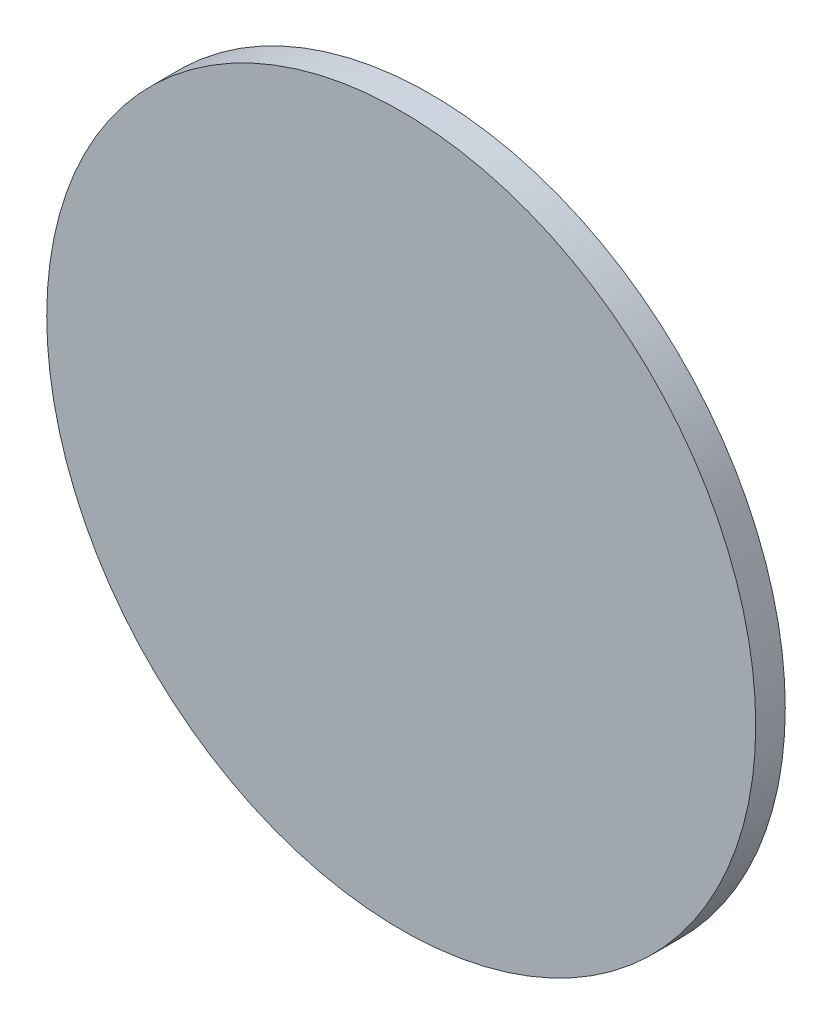
ISO-10303-21;
HEADER;
FILE_DESCRIPTION(('STEP AP214'),'2;1');
FILE_NAME('part.step','',(''),(''),'','','');
FILE_SCHEMA(('AUTOMOTIVE_DESIGN { 1 0 10303 214 1 1 1 1 }'));
ENDSEC;
DATA;
#1=APPLICATION_CONTEXT('core data for automotive mechanical design processes');
#2=APPLICATION_PROTOCOL_DEFINITION('international standard','automotive_design',2000,#1);
#3=PRODUCT_CONTEXT('',#1,'mechanical');
#4=PRODUCT('Part','Part','',(#3));
#5=PRODUCT_RELATED_PRODUCT_CATEGORY('part','',(#4));
#6=PRODUCT_DEFINITION_FORMATION('','',#4);
#7=PRODUCT_DEFINITION_CONTEXT('part definition',#1,'design');
#8=PRODUCT_DEFINITION('design','',#6,#7);
#9=PRODUCT_DEFINITION_SHAPE('','',#8);
#10=(LENGTH_UNIT() NAMED_UNIT(*) SI_UNIT(.MILLI.,.METRE.));
#11=(NAMED_UNIT(*) PLANE_ANGLE_UNIT() SI_UNIT($,.RADIAN.));
#12=(NAMED_UNIT(*) SI_UNIT($,.STERADIAN.) SOLID_ANGLE_UNIT());
#13=UNCERTAINTY_MEASURE_WITH_UNIT(LENGTH_MEASURE(1.E-05),#10,'distance_accuracy_value','');
#14=(GEOMETRIC_REPRESENTATION_CONTEXT(3) GLOBAL_UNCERTAINTY_ASSIGNED_CONTEXT((#13)) GLOBAL_UNIT_ASSIGNED_CONTEXT((#10,
#11,#12)) REPRESENTATION_CONTEXT('',''));
#15=CARTESIAN_POINT('',(0.,0.,0.));
#16=DIRECTION('',(0.,0.,1.));
#17=DIRECTION('',(1.,0.,0.));
#18=AXIS2_PLACEMENT_3D('',#15,#16,#17);
#19=CARTESIAN_POINT('',(0.,0.,6.35));
#20=DIRECTION('',(0.,0.,-1.));
#21=DIRECTION('',(-1.,0.,0.));
#22=AXIS2_PLACEMENT_3D('',#19,#20,#21);
#23=CYLINDRICAL_SURFACE('',#22,76.2);
#24=CARTESIAN_POINT('',(0.,0.,6.35));
#25=DIRECTION('',(0.,0.,1.));
#26=DIRECTION('',(1.,0.,0.));
#27=AXIS2_PLACEMENT_3D('',#24,#25,#26);
#28=CIRCLE('',#27,76.2);
#29=CARTESIAN_POINT('',(76.2,0.,6.35));
#30=VERTEX_POINT('',#29);
#31=EDGE_CURVE('E10',#30,#30,#28,.T.);
#32=ORIENTED_EDGE('',*,*,#31,.F.);
#33=EDGE_LOOP('',(#32));
#34=FACE_BOUND('',#33,.T.);
#35=CARTESIAN_POINT('',(0.,0.,0.));
#36=DIRECTION('',(0.,0.,1.));
#37=DIRECTION('',(1.,0.,0.));
#38=AXIS2_PLACEMENT_3D('',#35,#36,#37);
#39=CIRCLE('',#38,76.2);
#40=CARTESIAN_POINT('',(76.2,0.,0.));
#41=VERTEX_POINT('',#40);
#42=EDGE_CURVE('E34',#41,#41,#39,.T.);
#43=ORIENTED_EDGE('',*,*,#42,.T.);
#44=EDGE_LOOP('',(#43));
#45=FACE_BOUND('',#44,.T.);
#46=ADVANCED_FACE('F31',(#34,#45),#23,.T.);
#47=CARTESIAN_POINT('',(0.,0.,6.35));
#48=DIRECTION('',(0.,0.,1.));
#49=DIRECTION('',(1.,0.,0.));
#50=AXIS2_PLACEMENT_3D('',#47,#48,#49);
#51=PLANE('',#50);
#52=ORIENTED_EDGE('',*,*,#31,.T.);
#53=EDGE_LOOP('',(#52));
#54=FACE_BOUND('',#53,.T.);
#55=ADVANCED_FACE('F46',(#54),#51,.T.);
#56=CARTESIAN_POINT('',(0.,0.,0.));
#57=DIRECTION('',(0.,0.,1.));
#58=DIRECTION('',(1.,0.,0.));
#59=AXIS2_PLACEMENT_3D('',#56,#57,#58);
#60=PLANE('',#59);
#61=ORIENTED_EDGE('',*,*,#42,.F.);
#62=EDGE_LOOP('',(#61));
#63=FACE_BOUND('',#62,.T.);
#64=ADVANCED_FACE('F44',(#63),#60,.F.);
#65=CLOSED_SHELL('',(#46,#55,#64));
#66=MANIFOLD_SOLID_BREP('B2',#65);
#67=ADVANCED_BREP_SHAPE_REPRESENTATION('',(#18,#66),#14);
#68=SHAPE_DEFINITION_REPRESENTATION(#9,#67);
ENDSEC;
END-ISO-10303-21;
